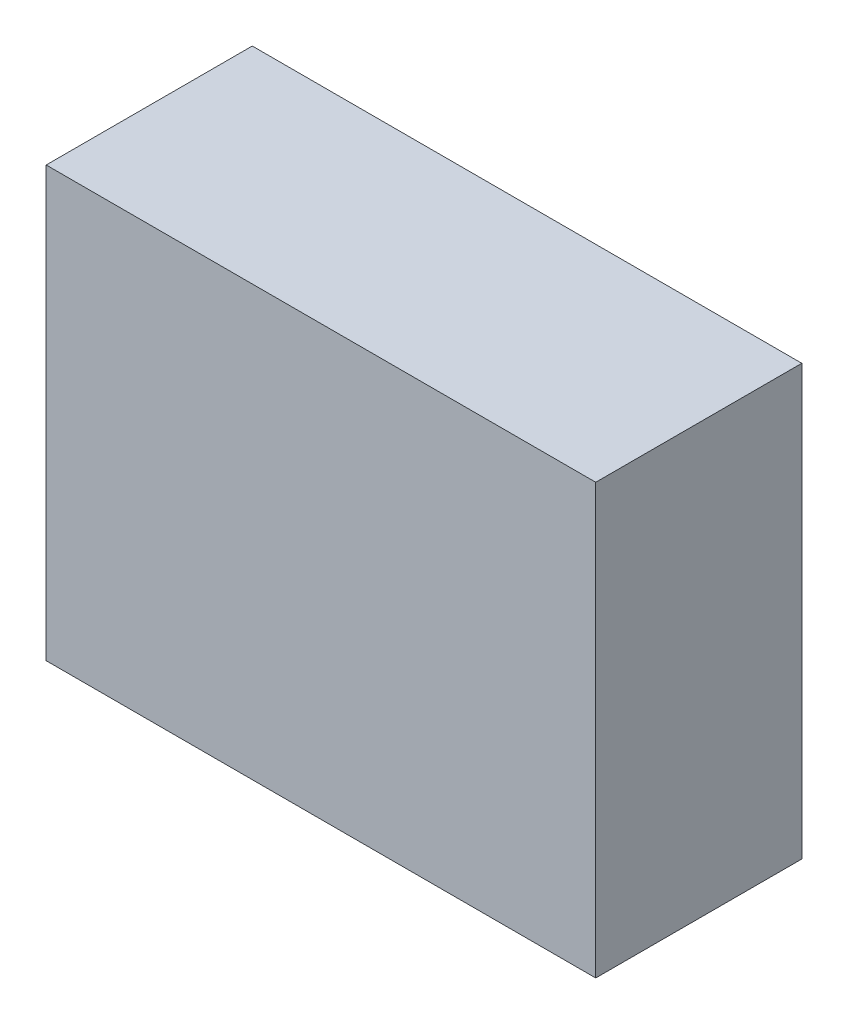
ISO-10303-21;
HEADER;
FILE_DESCRIPTION(('STEP AP214'),'2;1');
FILE_NAME('part.step','',(''),(''),'','','');
FILE_SCHEMA(('AUTOMOTIVE_DESIGN { 1 0 10303 214 1 1 1 1 }'));
ENDSEC;
DATA;
#1=APPLICATION_CONTEXT('core data for automotive mechanical design processes');
#2=APPLICATION_PROTOCOL_DEFINITION('international standard','automotive_design',2000,#1);
#3=PRODUCT_CONTEXT('',#1,'mechanical');
#4=PRODUCT('Part','Part','',(#3));
#5=PRODUCT_RELATED_PRODUCT_CATEGORY('part','',(#4));
#6=PRODUCT_DEFINITION_FORMATION('','',#4);
#7=PRODUCT_DEFINITION_CONTEXT('part definition',#1,'design');
#8=PRODUCT_DEFINITION('design','',#6,#7);
#9=PRODUCT_DEFINITION_SHAPE('','',#8);
#10=(LENGTH_UNIT() NAMED_UNIT(*) SI_UNIT(.MILLI.,.METRE.));
#11=(NAMED_UNIT(*) PLANE_ANGLE_UNIT() SI_UNIT($,.RADIAN.));
#12=(NAMED_UNIT(*) SI_UNIT($,.STERADIAN.) SOLID_ANGLE_UNIT());
#13=UNCERTAINTY_MEASURE_WITH_UNIT(LENGTH_MEASURE(1.E-05),#10,'distance_accuracy_value','');
#14=(GEOMETRIC_REPRESENTATION_CONTEXT(3) GLOBAL_UNCERTAINTY_ASSIGNED_CONTEXT((#13)) GLOBAL_UNIT_ASSIGNED_CONTEXT((#10,
#11,#12)) REPRESENTATION_CONTEXT('',''));
#15=CARTESIAN_POINT('',(0.,0.,0.));
#16=DIRECTION('',(0.,0.,1.));
#17=DIRECTION('',(1.,0.,0.));
#18=AXIS2_PLACEMENT_3D('',#15,#16,#17);
#19=CARTESIAN_POINT('',(24.,-18.75,18.));
#20=DIRECTION('',(-1.,0.,0.));
#21=DIRECTION('',(0.,0.,1.));
#22=AXIS2_PLACEMENT_3D('',#19,#20,#21);
#23=PLANE('',#22);
#24=DIRECTION('',(0.,1.,0.));
#25=VECTOR('',#24,1.);
#26=CARTESIAN_POINT('',(24.,-18.75,0.));
#27=LINE('',#26,#25);
#28=CARTESIAN_POINT('',(24.,-18.75,0.));
#29=VERTEX_POINT('',#28);
#30=CARTESIAN_POINT('',(24.,18.75,0.));
#31=VERTEX_POINT('',#30);
#32=EDGE_CURVE('E102',#29,#31,#27,.T.);
#33=ORIENTED_EDGE('',*,*,#32,.T.);
#34=DIRECTION('',(0.,0.,-1.));
#35=VECTOR('',#34,1.);
#36=CARTESIAN_POINT('',(24.,18.75,18.));
#37=LINE('',#36,#35);
#38=CARTESIAN_POINT('',(24.,18.75,18.));
#39=VERTEX_POINT('',#38);
#40=EDGE_CURVE('E11',#39,#31,#37,.T.);
#41=ORIENTED_EDGE('',*,*,#40,.F.);
#42=DIRECTION('',(0.,1.,0.));
#43=VECTOR('',#42,1.);
#44=CARTESIAN_POINT('',(24.,-18.75,18.));
#45=LINE('',#44,#43);
#46=CARTESIAN_POINT('',(24.,-18.75,18.));
#47=VERTEX_POINT('',#46);
#48=EDGE_CURVE('E90',#47,#39,#45,.T.);
#49=ORIENTED_EDGE('',*,*,#48,.F.);
#50=DIRECTION('',(0.,0.,-1.));
#51=VECTOR('',#50,1.);
#52=CARTESIAN_POINT('',(24.,-18.75,18.));
#53=LINE('',#52,#51);
#54=EDGE_CURVE('E98',#47,#29,#53,.T.);
#55=ORIENTED_EDGE('',*,*,#54,.T.);
#56=EDGE_LOOP('',(#33,#41,#49,#55));
#57=FACE_BOUND('',#56,.T.);
#58=ADVANCED_FACE('F39',(#57),#23,.F.);
#59=CARTESIAN_POINT('',(-24.,18.75,18.));
#60=DIRECTION('',(0.,-1.,0.));
#61=DIRECTION('',(0.,0.,-1.));
#62=AXIS2_PLACEMENT_3D('',#59,#60,#61);
#63=PLANE('',#62);
#64=DIRECTION('',(-1.,0.,0.));
#65=VECTOR('',#64,1.);
#66=CARTESIAN_POINT('',(-24.,18.75,0.));
#67=LINE('',#66,#65);
#68=CARTESIAN_POINT('',(-24.,18.75,0.));
#69=VERTEX_POINT('',#68);
#70=EDGE_CURVE('E94',#31,#69,#67,.T.);
#71=ORIENTED_EDGE('',*,*,#70,.T.);
#72=DIRECTION('',(0.,0.,-1.));
#73=VECTOR('',#72,1.);
#74=CARTESIAN_POINT('',(-24.,18.75,18.));
#75=LINE('',#74,#73);
#76=CARTESIAN_POINT('',(-24.,18.75,18.));
#77=VERTEX_POINT('',#76);
#78=EDGE_CURVE('E47',#77,#69,#75,.T.);
#79=ORIENTED_EDGE('',*,*,#78,.F.);
#80=DIRECTION('',(-1.,0.,0.));
#81=VECTOR('',#80,1.);
#82=CARTESIAN_POINT('',(-24.,18.75,18.));
#83=LINE('',#82,#81);
#84=EDGE_CURVE('E85',#39,#77,#83,.T.);
#85=ORIENTED_EDGE('',*,*,#84,.F.);
#86=ORIENTED_EDGE('',*,*,#40,.T.);
#87=EDGE_LOOP('',(#71,#79,#85,#86));
#88=FACE_BOUND('',#87,.T.);
#89=ADVANCED_FACE('F93',(#88),#63,.F.);
#90=CARTESIAN_POINT('',(-24.,-18.75,18.));
#91=DIRECTION('',(1.,0.,0.));
#92=DIRECTION('',(0.,0.,-1.));
#93=AXIS2_PLACEMENT_3D('',#90,#91,#92);
#94=PLANE('',#93);
#95=DIRECTION('',(0.,-1.,0.));
#96=VECTOR('',#95,1.);
#97=CARTESIAN_POINT('',(-24.,-18.75,0.));
#98=LINE('',#97,#96);
#99=CARTESIAN_POINT('',(-24.,-18.75,0.));
#100=VERTEX_POINT('',#99);
#101=EDGE_CURVE('E72',#69,#100,#98,.T.);
#102=ORIENTED_EDGE('',*,*,#101,.T.);
#103=DIRECTION('',(0.,0.,-1.));
#104=VECTOR('',#103,1.);
#105=CARTESIAN_POINT('',(-24.,-18.75,18.));
#106=LINE('',#105,#104);
#107=CARTESIAN_POINT('',(-24.,-18.75,18.));
#108=VERTEX_POINT('',#107);
#109=EDGE_CURVE('E95',#108,#100,#106,.T.);
#110=ORIENTED_EDGE('',*,*,#109,.F.);
#111=DIRECTION('',(0.,-1.,0.));
#112=VECTOR('',#111,1.);
#113=CARTESIAN_POINT('',(-24.,-18.75,18.));
#114=LINE('',#113,#112);
#115=EDGE_CURVE('E88',#77,#108,#114,.T.);
#116=ORIENTED_EDGE('',*,*,#115,.F.);
#117=ORIENTED_EDGE('',*,*,#78,.T.);
#118=EDGE_LOOP('',(#102,#110,#116,#117));
#119=FACE_BOUND('',#118,.T.);
#120=ADVANCED_FACE('F96',(#119),#94,.F.);
#121=CARTESIAN_POINT('',(-24.,-18.75,18.));
#122=DIRECTION('',(0.,1.,0.));
#123=DIRECTION('',(0.,0.,1.));
#124=AXIS2_PLACEMENT_3D('',#121,#122,#123);
#125=PLANE('',#124);
#126=DIRECTION('',(1.,0.,0.));
#127=VECTOR('',#126,1.);
#128=CARTESIAN_POINT('',(-24.,-18.75,0.));
#129=LINE('',#128,#127);
#130=EDGE_CURVE('E78',#100,#29,#129,.T.);
#131=ORIENTED_EDGE('',*,*,#130,.T.);
#132=ORIENTED_EDGE('',*,*,#54,.F.);
#133=DIRECTION('',(1.,0.,0.));
#134=VECTOR('',#133,1.);
#135=CARTESIAN_POINT('',(-24.,-18.75,18.));
#136=LINE('',#135,#134);
#137=EDGE_CURVE('E55',#108,#47,#136,.T.);
#138=ORIENTED_EDGE('',*,*,#137,.F.);
#139=ORIENTED_EDGE('',*,*,#109,.T.);
#140=EDGE_LOOP('',(#131,#132,#138,#139));
#141=FACE_BOUND('',#140,.T.);
#142=ADVANCED_FACE('F109',(#141),#125,.F.);
#143=CARTESIAN_POINT('',(0.,0.,18.));
#144=DIRECTION('',(0.,0.,-1.));
#145=DIRECTION('',(-1.,0.,0.));
#146=AXIS2_PLACEMENT_3D('',#143,#144,#145);
#147=PLANE('',#146);
#148=ORIENTED_EDGE('',*,*,#48,.T.);
#149=ORIENTED_EDGE('',*,*,#84,.T.);
#150=ORIENTED_EDGE('',*,*,#115,.T.);
#151=ORIENTED_EDGE('',*,*,#137,.T.);
#152=EDGE_LOOP('',(#148,#149,#150,#151));
#153=FACE_BOUND('',#152,.T.);
#154=ADVANCED_FACE('F86',(#153),#147,.F.);
#155=CARTESIAN_POINT('',(0.,0.,0.));
#156=DIRECTION('',(0.,0.,-1.));
#157=DIRECTION('',(-1.,0.,0.));
#158=AXIS2_PLACEMENT_3D('',#155,#156,#157);
#159=PLANE('',#158);
#160=ORIENTED_EDGE('',*,*,#32,.F.);
#161=ORIENTED_EDGE('',*,*,#130,.F.);
#162=ORIENTED_EDGE('',*,*,#101,.F.);
#163=ORIENTED_EDGE('',*,*,#70,.F.);
#164=EDGE_LOOP('',(#160,#161,#162,#163));
#165=FACE_BOUND('',#164,.T.);
#166=ADVANCED_FACE('F112',(#165),#159,.T.);
#167=CLOSED_SHELL('',(#58,#89,#120,#142,#154,#166));
#168=MANIFOLD_SOLID_BREP('B2',#167);
#169=ADVANCED_BREP_SHAPE_REPRESENTATION('',(#18,#168),#14);
#170=SHAPE_DEFINITION_REPRESENTATION(#9,#169);
ENDSEC;
END-ISO-10303-21;
